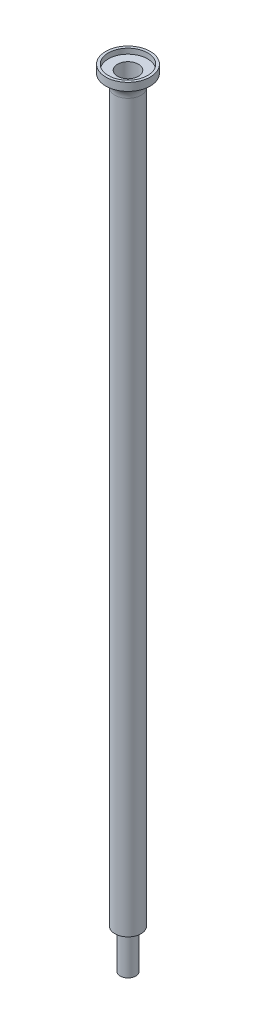
ISO-10303-21;
HEADER;
FILE_DESCRIPTION(('STEP AP214'),'2;1');
FILE_NAME('part.step','',(''),(''),'','','');
FILE_SCHEMA(('AUTOMOTIVE_DESIGN { 1 0 10303 214 1 1 1 1 }'));
ENDSEC;
DATA;
#1=APPLICATION_CONTEXT('core data for automotive mechanical design processes');
#2=APPLICATION_PROTOCOL_DEFINITION('international standard','automotive_design',2000,#1);
#3=PRODUCT_CONTEXT('',#1,'mechanical');
#4=PRODUCT('Part','Part','',(#3));
#5=PRODUCT_RELATED_PRODUCT_CATEGORY('part','',(#4));
#6=PRODUCT_DEFINITION_FORMATION('','',#4);
#7=PRODUCT_DEFINITION_CONTEXT('part definition',#1,'design');
#8=PRODUCT_DEFINITION('design','',#6,#7);
#9=PRODUCT_DEFINITION_SHAPE('','',#8);
#10=(LENGTH_UNIT() NAMED_UNIT(*) SI_UNIT(.MILLI.,.METRE.));
#11=(NAMED_UNIT(*) PLANE_ANGLE_UNIT() SI_UNIT($,.RADIAN.));
#12=(NAMED_UNIT(*) SI_UNIT($,.STERADIAN.) SOLID_ANGLE_UNIT());
#13=UNCERTAINTY_MEASURE_WITH_UNIT(LENGTH_MEASURE(1.E-05),#10,'distance_accuracy_value','');
#14=(GEOMETRIC_REPRESENTATION_CONTEXT(3) GLOBAL_UNCERTAINTY_ASSIGNED_CONTEXT((#13)) GLOBAL_UNIT_ASSIGNED_CONTEXT((#10,
#11,#12)) REPRESENTATION_CONTEXT('',''));
#15=CARTESIAN_POINT('',(0.,0.,0.));
#16=DIRECTION('',(0.,0.,1.));
#17=DIRECTION('',(1.,0.,0.));
#18=AXIS2_PLACEMENT_3D('',#15,#16,#17);
#19=CARTESIAN_POINT('',(0.,64.1903300594672,0.));
#20=DIRECTION('',(0.,-1.,0.));
#21=DIRECTION('',(0.,0.,-1.));
#22=AXIS2_PLACEMENT_3D('',#19,#20,#21);
#23=PLANE('',#22);
#24=CARTESIAN_POINT('',(0.,64.1903300594672,0.));
#25=DIRECTION('',(0.,-1.,0.));
#26=DIRECTION('',(0.,0.,-1.));
#27=AXIS2_PLACEMENT_3D('',#24,#25,#26);
#28=CIRCLE('',#27,7.5);
#29=CARTESIAN_POINT('',(0.,64.1903300594672,-7.5));
#30=VERTEX_POINT('',#29);
#31=EDGE_CURVE('E62',#30,#30,#28,.F.);
#32=ORIENTED_EDGE('',*,*,#31,.F.);
#33=EDGE_LOOP('',(#32));
#34=FACE_BOUND('',#33,.T.);
#35=CARTESIAN_POINT('',(0.,64.1903300594672,0.));
#36=DIRECTION('',(0.,1.,0.));
#37=DIRECTION('',(0.,0.,1.));
#38=AXIS2_PLACEMENT_3D('',#35,#36,#37);
#39=CIRCLE('',#38,8.5);
#40=CARTESIAN_POINT('',(0.,64.1903300594672,8.5));
#41=VERTEX_POINT('',#40);
#42=EDGE_CURVE('E43',#41,#41,#39,.T.);
#43=ORIENTED_EDGE('',*,*,#42,.T.);
#44=EDGE_LOOP('',(#43));
#45=FACE_BOUND('',#44,.T.);
#46=ADVANCED_FACE('F36',(#34,#45),#23,.F.);
#47=CARTESIAN_POINT('',(0.,68.8439642374539,0.));
#48=DIRECTION('',(0.,1.,0.));
#49=DIRECTION('',(0.,0.,1.));
#50=AXIS2_PLACEMENT_3D('',#47,#48,#49);
#51=CYLINDRICAL_SURFACE('',#50,8.5);
#52=ORIENTED_EDGE('',*,*,#42,.F.);
#53=EDGE_LOOP('',(#52));
#54=FACE_BOUND('',#53,.T.);
#55=CARTESIAN_POINT('',(0.,61.1903300594672,0.));
#56=DIRECTION('',(0.,1.,0.));
#57=DIRECTION('',(0.,0.,1.));
#58=AXIS2_PLACEMENT_3D('',#55,#56,#57);
#59=CIRCLE('',#58,8.5);
#60=CARTESIAN_POINT('',(0.,61.1903300594672,8.5));
#61=VERTEX_POINT('',#60);
#62=EDGE_CURVE('E47',#61,#61,#59,.T.);
#63=ORIENTED_EDGE('',*,*,#62,.T.);
#64=EDGE_LOOP('',(#63));
#65=FACE_BOUND('',#64,.T.);
#66=ADVANCED_FACE('F99',(#54,#65),#51,.T.);
#67=CARTESIAN_POINT('',(0.,68.8439642374539,0.));
#68=DIRECTION('',(0.,1.,0.));
#69=DIRECTION('',(0.,0.,1.));
#70=AXIS2_PLACEMENT_3D('',#67,#68,#69);
#71=CYLINDRICAL_SURFACE('',#70,5.00000000000002);
#72=CARTESIAN_POINT('',(0.,56.4206340523825,0.));
#73=DIRECTION('',(0.,1.,0.));
#74=DIRECTION('',(0.,0.,1.));
#75=AXIS2_PLACEMENT_3D('',#72,#73,#74);
#76=CIRCLE('',#75,5.00000000000002);
#77=CARTESIAN_POINT('',(0.,56.4206340523825,5.00000000000002));
#78=VERTEX_POINT('',#77);
#79=EDGE_CURVE('E10',#78,#78,#76,.F.);
#80=ORIENTED_EDGE('',*,*,#79,.T.);
#81=EDGE_LOOP('',(#80));
#82=FACE_BOUND('',#81,.T.);
#83=CARTESIAN_POINT('',(0.,-220.809669940533,0.));
#84=DIRECTION('',(0.,1.,0.));
#85=DIRECTION('',(0.,0.,1.));
#86=AXIS2_PLACEMENT_3D('',#83,#84,#85);
#87=CIRCLE('',#86,5.00000000000004);
#88=CARTESIAN_POINT('',(0.,-220.809669940533,5.00000000000004));
#89=VERTEX_POINT('',#88);
#90=EDGE_CURVE('E51',#89,#89,#87,.T.);
#91=ORIENTED_EDGE('',*,*,#90,.T.);
#92=EDGE_LOOP('',(#91));
#93=FACE_BOUND('',#92,.T.);
#94=ADVANCED_FACE('F104',(#82,#93),#71,.T.);
#95=CARTESIAN_POINT('',(0.,-220.809669940533,-5.00000000000004));
#96=DIRECTION('',(0.,1.,0.));
#97=DIRECTION('',(0.,0.,1.));
#98=AXIS2_PLACEMENT_3D('',#95,#96,#97);
#99=PLANE('',#98);
#100=ORIENTED_EDGE('',*,*,#90,.F.);
#101=EDGE_LOOP('',(#100));
#102=FACE_BOUND('',#101,.T.);
#103=CARTESIAN_POINT('',(0.,-220.809669940533,0.));
#104=DIRECTION('',(0.,1.,0.));
#105=DIRECTION('',(0.,0.,1.));
#106=AXIS2_PLACEMENT_3D('',#103,#104,#105);
#107=CIRCLE('',#106,3.00000000000004);
#108=CARTESIAN_POINT('',(0.,-220.809669940533,3.00000000000004));
#109=VERTEX_POINT('',#108);
#110=EDGE_CURVE('E56',#109,#109,#107,.T.);
#111=ORIENTED_EDGE('',*,*,#110,.T.);
#112=EDGE_LOOP('',(#111));
#113=FACE_BOUND('',#112,.T.);
#114=ADVANCED_FACE('F111',(#102,#113),#99,.F.);
#115=CARTESIAN_POINT('',(0.,68.8439642374539,0.));
#116=DIRECTION('',(0.,1.,0.));
#117=DIRECTION('',(0.,0.,1.));
#118=AXIS2_PLACEMENT_3D('',#115,#116,#117);
#119=CYLINDRICAL_SURFACE('',#118,3.00000000000004);
#120=ORIENTED_EDGE('',*,*,#110,.F.);
#121=EDGE_LOOP('',(#120));
#122=FACE_BOUND('',#121,.T.);
#123=CARTESIAN_POINT('',(0.,-235.809669940533,0.));
#124=DIRECTION('',(0.,1.,0.));
#125=DIRECTION('',(0.,0.,1.));
#126=AXIS2_PLACEMENT_3D('',#123,#124,#125);
#127=CIRCLE('',#126,3.00000000000004);
#128=CARTESIAN_POINT('',(0.,-235.809669940533,3.00000000000004));
#129=VERTEX_POINT('',#128);
#130=EDGE_CURVE('E59',#129,#129,#127,.T.);
#131=ORIENTED_EDGE('',*,*,#130,.T.);
#132=EDGE_LOOP('',(#131));
#133=FACE_BOUND('',#132,.T.);
#134=ADVANCED_FACE('F114',(#122,#133),#119,.T.);
#135=CARTESIAN_POINT('',(0.,-235.809669940533,-3.00000000000004));
#136=DIRECTION('',(0.,1.,0.));
#137=DIRECTION('',(0.,0.,1.));
#138=AXIS2_PLACEMENT_3D('',#135,#136,#137);
#139=PLANE('',#138);
#140=CARTESIAN_POINT('',(0.,-235.809669940533,0.));
#141=DIRECTION('',(0.,1.,0.));
#142=DIRECTION('',(0.,0.,1.));
#143=AXIS2_PLACEMENT_3D('',#140,#141,#142);
#144=CIRCLE('',#143,2.00000000000004);
#145=CARTESIAN_POINT('',(0.,-235.809669940533,2.00000000000004));
#146=VERTEX_POINT('',#145);
#147=EDGE_CURVE('E70',#146,#146,#144,.T.);
#148=ORIENTED_EDGE('',*,*,#147,.T.);
#149=EDGE_LOOP('',(#148));
#150=FACE_BOUND('',#149,.T.);
#151=ORIENTED_EDGE('',*,*,#130,.F.);
#152=EDGE_LOOP('',(#151));
#153=FACE_BOUND('',#152,.T.);
#154=ADVANCED_FACE('F81',(#150,#153),#139,.F.);
#155=CARTESIAN_POINT('',(0.,68.8439642374539,0.));
#156=DIRECTION('',(0.,1.,0.));
#157=DIRECTION('',(0.,0.,1.));
#158=AXIS2_PLACEMENT_3D('',#155,#156,#157);
#159=CYLINDRICAL_SURFACE('',#158,7.5);
#160=ORIENTED_EDGE('',*,*,#31,.T.);
#161=EDGE_LOOP('',(#160));
#162=FACE_BOUND('',#161,.T.);
#163=CARTESIAN_POINT('',(0.,62.1903300594672,0.));
#164=DIRECTION('',(0.,1.,0.));
#165=DIRECTION('',(0.,0.,1.));
#166=AXIS2_PLACEMENT_3D('',#163,#164,#165);
#167=CIRCLE('',#166,7.5);
#168=CARTESIAN_POINT('',(0.,62.1903300594672,7.5));
#169=VERTEX_POINT('',#168);
#170=EDGE_CURVE('E65',#169,#169,#167,.T.);
#171=ORIENTED_EDGE('',*,*,#170,.F.);
#172=EDGE_LOOP('',(#171));
#173=FACE_BOUND('',#172,.T.);
#174=ADVANCED_FACE('F119',(#162,#173),#159,.F.);
#175=CARTESIAN_POINT('',(0.,62.1903300594672,-8.5));
#176=DIRECTION('',(0.,1.,0.));
#177=DIRECTION('',(0.,0.,1.));
#178=AXIS2_PLACEMENT_3D('',#175,#176,#177);
#179=PLANE('',#178);
#180=ORIENTED_EDGE('',*,*,#170,.T.);
#181=EDGE_LOOP('',(#180));
#182=FACE_BOUND('',#181,.T.);
#183=CARTESIAN_POINT('',(0.,62.1903300594672,0.));
#184=DIRECTION('',(0.,1.,0.));
#185=DIRECTION('',(0.,0.,1.));
#186=AXIS2_PLACEMENT_3D('',#183,#184,#185);
#187=CIRCLE('',#186,4.00000000000002);
#188=CARTESIAN_POINT('',(0.,62.1903300594672,4.00000000000002));
#189=VERTEX_POINT('',#188);
#190=EDGE_CURVE('E73',#189,#189,#187,.T.);
#191=ORIENTED_EDGE('',*,*,#190,.F.);
#192=EDGE_LOOP('',(#191));
#193=FACE_BOUND('',#192,.T.);
#194=ADVANCED_FACE('F123',(#182,#193),#179,.T.);
#195=CARTESIAN_POINT('',(0.,68.8439642374539,0.));
#196=DIRECTION('',(0.,1.,0.));
#197=DIRECTION('',(0.,0.,1.));
#198=AXIS2_PLACEMENT_3D('',#195,#196,#197);
#199=CYLINDRICAL_SURFACE('',#198,4.00000000000002);
#200=ORIENTED_EDGE('',*,*,#190,.T.);
#201=EDGE_LOOP('',(#200));
#202=FACE_BOUND('',#201,.T.);
#203=CARTESIAN_POINT('',(0.,-219.809669940533,0.));
#204=DIRECTION('',(0.,1.,0.));
#205=DIRECTION('',(0.,0.,1.));
#206=AXIS2_PLACEMENT_3D('',#203,#204,#205);
#207=CIRCLE('',#206,4.00000000000002);
#208=CARTESIAN_POINT('',(0.,-219.809669940533,4.00000000000002));
#209=VERTEX_POINT('',#208);
#210=EDGE_CURVE('E69',#209,#209,#207,.T.);
#211=ORIENTED_EDGE('',*,*,#210,.F.);
#212=EDGE_LOOP('',(#211));
#213=FACE_BOUND('',#212,.T.);
#214=ADVANCED_FACE('F94',(#202,#213),#199,.F.);
#215=CARTESIAN_POINT('',(0.,-219.809669940533,-5.00000000000004));
#216=DIRECTION('',(0.,1.,0.));
#217=DIRECTION('',(0.,0.,1.));
#218=AXIS2_PLACEMENT_3D('',#215,#216,#217);
#219=PLANE('',#218);
#220=ORIENTED_EDGE('',*,*,#210,.T.);
#221=EDGE_LOOP('',(#220));
#222=FACE_BOUND('',#221,.T.);
#223=CARTESIAN_POINT('',(0.,-219.809669940533,0.));
#224=DIRECTION('',(0.,1.,0.));
#225=DIRECTION('',(0.,0.,1.));
#226=AXIS2_PLACEMENT_3D('',#223,#224,#225);
#227=CIRCLE('',#226,2.00000000000004);
#228=CARTESIAN_POINT('',(0.,-219.809669940533,2.00000000000004));
#229=VERTEX_POINT('',#228);
#230=EDGE_CURVE('E66',#229,#229,#227,.T.);
#231=ORIENTED_EDGE('',*,*,#230,.F.);
#232=EDGE_LOOP('',(#231));
#233=FACE_BOUND('',#232,.T.);
#234=ADVANCED_FACE('F86',(#222,#233),#219,.T.);
#235=CARTESIAN_POINT('',(0.,68.8439642374539,0.));
#236=DIRECTION('',(0.,1.,0.));
#237=DIRECTION('',(0.,0.,1.));
#238=AXIS2_PLACEMENT_3D('',#235,#236,#237);
#239=CYLINDRICAL_SURFACE('',#238,2.00000000000004);
#240=ORIENTED_EDGE('',*,*,#230,.T.);
#241=EDGE_LOOP('',(#240));
#242=FACE_BOUND('',#241,.T.);
#243=ORIENTED_EDGE('',*,*,#147,.F.);
#244=EDGE_LOOP('',(#243));
#245=FACE_BOUND('',#244,.T.);
#246=ADVANCED_FACE('F84',(#242,#245),#239,.F.);
#247=CARTESIAN_POINT('',(0.,56.4206340523825,0.));
#248=DIRECTION('',(0.,1.,0.));
#249=DIRECTION('',(0.,0.,1.));
#250=AXIS2_PLACEMENT_3D('',#247,#248,#249);
#251=TOROIDAL_SURFACE('',#250,10.,5.);
#252=ORIENTED_EDGE('',*,*,#79,.F.);
#253=EDGE_LOOP('',(#252));
#254=FACE_BOUND('',#253,.T.);
#255=ORIENTED_EDGE('',*,*,#62,.F.);
#256=EDGE_LOOP('',(#255));
#257=FACE_BOUND('',#256,.T.);
#258=ADVANCED_FACE('F38',(#254,#257),#251,.F.);
#259=CLOSED_SHELL('',(#46,#66,#94,#114,#134,#154,#174,#194,#214,#234,#246,#258));
#260=MANIFOLD_SOLID_BREP('B2',#259);
#261=ADVANCED_BREP_SHAPE_REPRESENTATION('',(#18,#260),#14);
#262=SHAPE_DEFINITION_REPRESENTATION(#9,#261);
ENDSEC;
END-ISO-10303-21;
